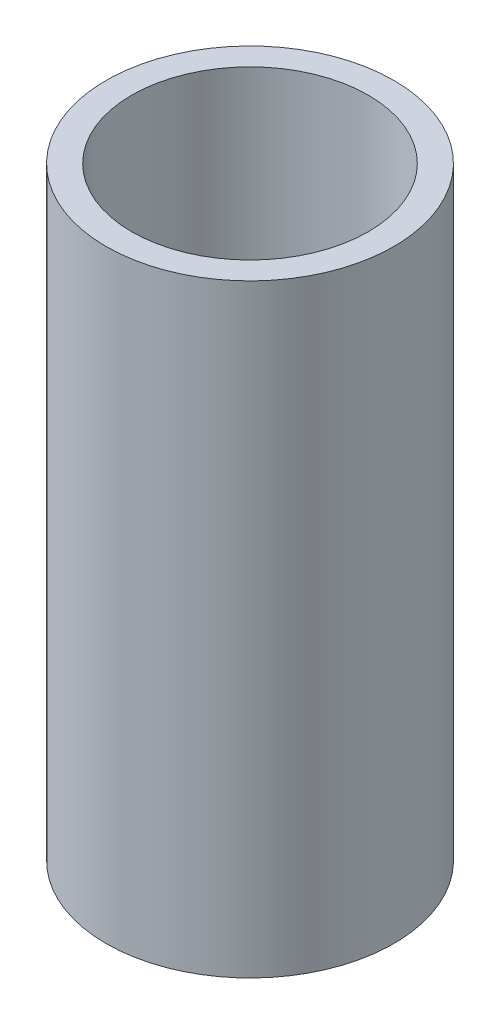
ISO-10303-21;
HEADER;
FILE_DESCRIPTION(('STEP AP214'),'2;1');
FILE_NAME('part.step','',(''),(''),'','','');
FILE_SCHEMA(('AUTOMOTIVE_DESIGN { 1 0 10303 214 1 1 1 1 }'));
ENDSEC;
DATA;
#1=APPLICATION_CONTEXT('core data for automotive mechanical design processes');
#2=APPLICATION_PROTOCOL_DEFINITION('international standard','automotive_design',2000,#1);
#3=PRODUCT_CONTEXT('',#1,'mechanical');
#4=PRODUCT('Part','Part','',(#3));
#5=PRODUCT_RELATED_PRODUCT_CATEGORY('part','',(#4));
#6=PRODUCT_DEFINITION_FORMATION('','',#4);
#7=PRODUCT_DEFINITION_CONTEXT('part definition',#1,'design');
#8=PRODUCT_DEFINITION('design','',#6,#7);
#9=PRODUCT_DEFINITION_SHAPE('','',#8);
#10=(LENGTH_UNIT() NAMED_UNIT(*) SI_UNIT(.MILLI.,.METRE.));
#11=(NAMED_UNIT(*) PLANE_ANGLE_UNIT() SI_UNIT($,.RADIAN.));
#12=(NAMED_UNIT(*) SI_UNIT($,.STERADIAN.) SOLID_ANGLE_UNIT());
#13=UNCERTAINTY_MEASURE_WITH_UNIT(LENGTH_MEASURE(1.E-05),#10,'distance_accuracy_value','');
#14=(GEOMETRIC_REPRESENTATION_CONTEXT(3) GLOBAL_UNCERTAINTY_ASSIGNED_CONTEXT((#13)) GLOBAL_UNIT_ASSIGNED_CONTEXT((#10,
#11,#12)) REPRESENTATION_CONTEXT('',''));
#15=CARTESIAN_POINT('',(0.,0.,0.));
#16=DIRECTION('',(0.,0.,1.));
#17=DIRECTION('',(1.,0.,0.));
#18=AXIS2_PLACEMENT_3D('',#15,#16,#17);
#19=CARTESIAN_POINT('',(0.,40.5,0.));
#20=DIRECTION('',(0.,1.,0.));
#21=DIRECTION('',(0.,0.,1.));
#22=AXIS2_PLACEMENT_3D('',#19,#20,#21);
#23=PLANE('',#22);
#24=CARTESIAN_POINT('',(0.,40.5,0.));
#25=DIRECTION('',(0.,1.,0.));
#26=DIRECTION('',(0.,0.,1.));
#27=AXIS2_PLACEMENT_3D('',#24,#25,#26);
#28=CIRCLE('',#27,9.652);
#29=CARTESIAN_POINT('',(0.,40.5,9.652));
#30=VERTEX_POINT('',#29);
#31=EDGE_CURVE('E10',#30,#30,#28,.T.);
#32=ORIENTED_EDGE('',*,*,#31,.T.);
#33=EDGE_LOOP('',(#32));
#34=FACE_BOUND('',#33,.T.);
#35=CARTESIAN_POINT('',(0.,40.5,0.));
#36=DIRECTION('',(0.,1.,0.));
#37=DIRECTION('',(0.,0.,1.));
#38=AXIS2_PLACEMENT_3D('',#35,#36,#37);
#39=CIRCLE('',#38,7.9375);
#40=CARTESIAN_POINT('',(0.,40.5,7.9375));
#41=VERTEX_POINT('',#40);
#42=EDGE_CURVE('E41',#41,#41,#39,.T.);
#43=ORIENTED_EDGE('',*,*,#42,.F.);
#44=EDGE_LOOP('',(#43));
#45=FACE_BOUND('',#44,.T.);
#46=ADVANCED_FACE('F30',(#34,#45),#23,.T.);
#47=CARTESIAN_POINT('',(0.,0.,0.));
#48=DIRECTION('',(0.,1.,0.));
#49=DIRECTION('',(0.,0.,1.));
#50=AXIS2_PLACEMENT_3D('',#47,#48,#49);
#51=PLANE('',#50);
#52=CARTESIAN_POINT('',(0.,0.,0.));
#53=DIRECTION('',(0.,1.,0.));
#54=DIRECTION('',(0.,0.,1.));
#55=AXIS2_PLACEMENT_3D('',#52,#53,#54);
#56=CIRCLE('',#55,9.652);
#57=CARTESIAN_POINT('',(0.,0.,9.652));
#58=VERTEX_POINT('',#57);
#59=EDGE_CURVE('E34',#58,#58,#56,.T.);
#60=ORIENTED_EDGE('',*,*,#59,.F.);
#61=EDGE_LOOP('',(#60));
#62=FACE_BOUND('',#61,.T.);
#63=CARTESIAN_POINT('',(0.,0.,0.));
#64=DIRECTION('',(0.,1.,0.));
#65=DIRECTION('',(0.,0.,1.));
#66=AXIS2_PLACEMENT_3D('',#63,#64,#65);
#67=CIRCLE('',#66,7.9375);
#68=CARTESIAN_POINT('',(0.,0.,7.9375));
#69=VERTEX_POINT('',#68);
#70=EDGE_CURVE('E43',#69,#69,#67,.T.);
#71=ORIENTED_EDGE('',*,*,#70,.T.);
#72=EDGE_LOOP('',(#71));
#73=FACE_BOUND('',#72,.T.);
#74=ADVANCED_FACE('F53',(#62,#73),#51,.F.);
#75=CARTESIAN_POINT('',(0.,40.5,0.));
#76=DIRECTION('',(0.,-1.,0.));
#77=DIRECTION('',(0.,0.,-1.));
#78=AXIS2_PLACEMENT_3D('',#75,#76,#77);
#79=CYLINDRICAL_SURFACE('',#78,9.652);
#80=ORIENTED_EDGE('',*,*,#31,.F.);
#81=EDGE_LOOP('',(#80));
#82=FACE_BOUND('',#81,.T.);
#83=ORIENTED_EDGE('',*,*,#59,.T.);
#84=EDGE_LOOP('',(#83));
#85=FACE_BOUND('',#84,.T.);
#86=ADVANCED_FACE('F32',(#82,#85),#79,.T.);
#87=CARTESIAN_POINT('',(0.,40.5,0.));
#88=DIRECTION('',(0.,-1.,0.));
#89=DIRECTION('',(0.,0.,-1.));
#90=AXIS2_PLACEMENT_3D('',#87,#88,#89);
#91=CYLINDRICAL_SURFACE('',#90,7.9375);
#92=ORIENTED_EDGE('',*,*,#42,.T.);
#93=EDGE_LOOP('',(#92));
#94=FACE_BOUND('',#93,.T.);
#95=ORIENTED_EDGE('',*,*,#70,.F.);
#96=EDGE_LOOP('',(#95));
#97=FACE_BOUND('',#96,.T.);
#98=ADVANCED_FACE('F49',(#94,#97),#91,.F.);
#99=CLOSED_SHELL('',(#46,#74,#86,#98));
#100=MANIFOLD_SOLID_BREP('B2',#99);
#101=ADVANCED_BREP_SHAPE_REPRESENTATION('',(#18,#100),#14);
#102=SHAPE_DEFINITION_REPRESENTATION(#9,#101);
ENDSEC;
END-ISO-10303-21;
